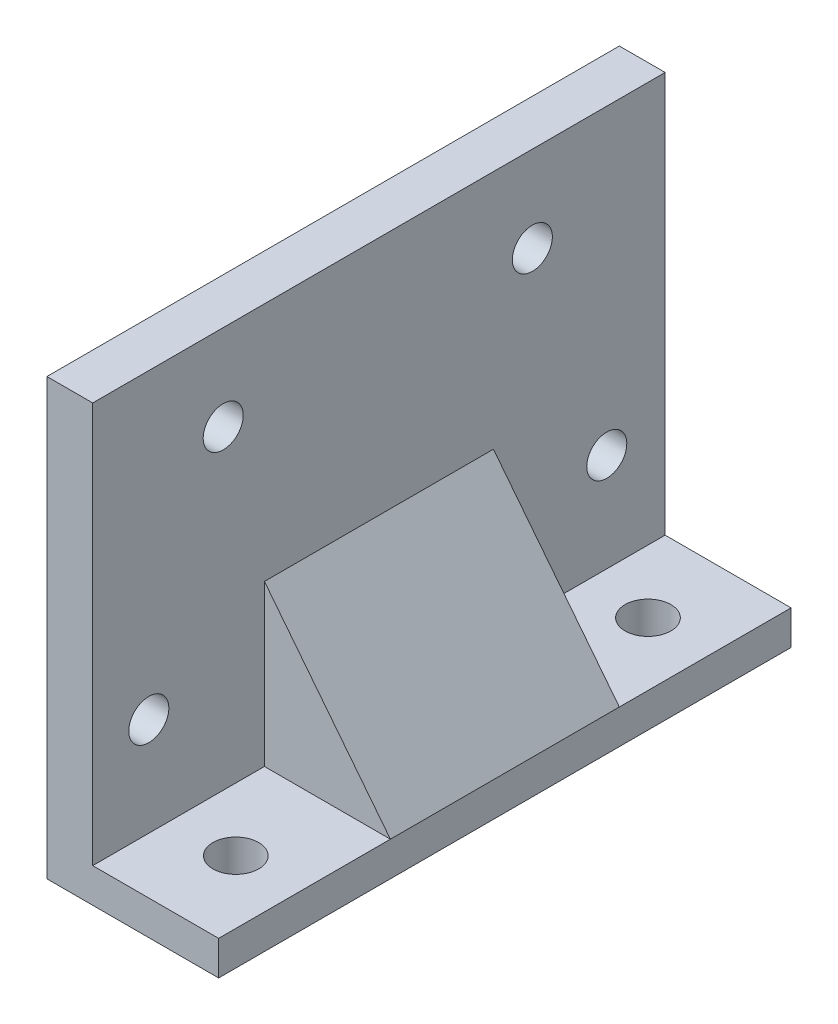
ISO-10303-21;
HEADER;
FILE_DESCRIPTION(('STEP AP214'),'2;1');
FILE_NAME('part.step','',(''),(''),'','','');
FILE_SCHEMA(('AUTOMOTIVE_DESIGN { 1 0 10303 214 1 1 1 1 }'));
ENDSEC;
DATA;
#1=APPLICATION_CONTEXT('core data for automotive mechanical design processes');
#2=APPLICATION_PROTOCOL_DEFINITION('international standard','automotive_design',2000,#1);
#3=PRODUCT_CONTEXT('',#1,'mechanical');
#4=PRODUCT('Part','Part','',(#3));
#5=PRODUCT_RELATED_PRODUCT_CATEGORY('part','',(#4));
#6=PRODUCT_DEFINITION_FORMATION('','',#4);
#7=PRODUCT_DEFINITION_CONTEXT('part definition',#1,'design');
#8=PRODUCT_DEFINITION('design','',#6,#7);
#9=PRODUCT_DEFINITION_SHAPE('','',#8);
#10=(LENGTH_UNIT() NAMED_UNIT(*) SI_UNIT(.MILLI.,.METRE.));
#11=(NAMED_UNIT(*) PLANE_ANGLE_UNIT() SI_UNIT($,.RADIAN.));
#12=(NAMED_UNIT(*) SI_UNIT($,.STERADIAN.) SOLID_ANGLE_UNIT());
#13=UNCERTAINTY_MEASURE_WITH_UNIT(LENGTH_MEASURE(1.E-05),#10,'distance_accuracy_value','');
#14=(GEOMETRIC_REPRESENTATION_CONTEXT(3) GLOBAL_UNCERTAINTY_ASSIGNED_CONTEXT((#13)) GLOBAL_UNIT_ASSIGNED_CONTEXT((#10,
#11,#12)) REPRESENTATION_CONTEXT('',''));
#15=CARTESIAN_POINT('',(0.,0.,0.));
#16=DIRECTION('',(0.,0.,1.));
#17=DIRECTION('',(1.,0.,0.));
#18=AXIS2_PLACEMENT_3D('',#15,#16,#17);
#19=CARTESIAN_POINT('',(15.,3.,50.));
#20=DIRECTION('',(0.,-1.,0.));
#21=DIRECTION('',(1.,0.,0.));
#22=AXIS2_PLACEMENT_3D('',#19,#20,#21);
#23=PLANE('',#22);
#24=CARTESIAN_POINT('',(9.5,3.,43.));
#25=DIRECTION('',(0.,1.,0.));
#26=DIRECTION('',(1.,0.,0.));
#27=AXIS2_PLACEMENT_3D('',#24,#25,#26);
#28=CIRCLE('',#27,2.);
#29=CARTESIAN_POINT('',(11.5,3.,43.));
#30=VERTEX_POINT('',#29);
#31=EDGE_CURVE('E172',#30,#30,#28,.T.);
#32=ORIENTED_EDGE('',*,*,#31,.F.);
#33=EDGE_LOOP('',(#32));
#34=FACE_BOUND('',#33,.T.);
#35=DIRECTION('',(1.,0.,0.));
#36=VECTOR('',#35,1.);
#37=CARTESIAN_POINT('',(15.,3.,35.));
#38=LINE('',#37,#36);
#39=CARTESIAN_POINT('',(4.,3.,35.));
#40=VERTEX_POINT('',#39);
#41=CARTESIAN_POINT('',(15.,3.,35.));
#42=VERTEX_POINT('',#41);
#43=EDGE_CURVE('E214',#40,#42,#38,.T.);
#44=ORIENTED_EDGE('',*,*,#43,.F.);
#45=DIRECTION('',(0.,0.,-1.));
#46=VECTOR('',#45,1.);
#47=CARTESIAN_POINT('',(4.,3.,50.));
#48=LINE('',#47,#46);
#49=CARTESIAN_POINT('',(4.,3.,50.));
#50=VERTEX_POINT('',#49);
#51=EDGE_CURVE('E255',#50,#40,#48,.T.);
#52=ORIENTED_EDGE('',*,*,#51,.F.);
#53=DIRECTION('',(-1.,0.,0.));
#54=VECTOR('',#53,1.);
#55=CARTESIAN_POINT('',(15.,3.,50.));
#56=LINE('',#55,#54);
#57=CARTESIAN_POINT('',(15.,3.,50.));
#58=VERTEX_POINT('',#57);
#59=EDGE_CURVE('E234',#58,#50,#56,.T.);
#60=ORIENTED_EDGE('',*,*,#59,.F.);
#61=DIRECTION('',(0.,0.,-1.));
#62=VECTOR('',#61,1.);
#63=CARTESIAN_POINT('',(15.,3.,50.));
#64=LINE('',#63,#62);
#65=EDGE_CURVE('E259',#58,#42,#64,.T.);
#66=ORIENTED_EDGE('',*,*,#65,.T.);
#67=EDGE_LOOP('',(#44,#52,#60,#66));
#68=FACE_BOUND('',#67,.T.);
#69=ADVANCED_FACE('F39',(#34,#68),#23,.F.);
#70=CARTESIAN_POINT('',(9.5,3.,7.));
#71=DIRECTION('',(0.,1.,0.));
#72=DIRECTION('',(-1.,0.,0.));
#73=AXIS2_PLACEMENT_3D('',#70,#71,#72);
#74=CIRCLE('',#73,2.);
#75=CARTESIAN_POINT('',(7.5,3.,7.));
#76=VERTEX_POINT('',#75);
#77=EDGE_CURVE('E176',#76,#76,#74,.T.);
#78=ORIENTED_EDGE('',*,*,#77,.F.);
#79=EDGE_LOOP('',(#78));
#80=FACE_BOUND('',#79,.T.);
#81=DIRECTION('',(-1.,0.,0.));
#82=VECTOR('',#81,1.);
#83=CARTESIAN_POINT('',(4.00000000000001,3.,15.));
#84=LINE('',#83,#82);
#85=CARTESIAN_POINT('',(15.,3.,15.));
#86=VERTEX_POINT('',#85);
#87=CARTESIAN_POINT('',(4.,3.,15.));
#88=VERTEX_POINT('',#87);
#89=EDGE_CURVE('E217',#86,#88,#84,.T.);
#90=ORIENTED_EDGE('',*,*,#89,.F.);
#91=CARTESIAN_POINT('',(15.,3.,0.));
#92=VERTEX_POINT('',#91);
#93=EDGE_CURVE('E258',#86,#92,#64,.T.);
#94=ORIENTED_EDGE('',*,*,#93,.T.);
#95=DIRECTION('',(-1.,0.,0.));
#96=VECTOR('',#95,1.);
#97=CARTESIAN_POINT('',(15.,3.,0.));
#98=LINE('',#97,#96);
#99=CARTESIAN_POINT('',(4.,3.,0.));
#100=VERTEX_POINT('',#99);
#101=EDGE_CURVE('E248',#92,#100,#98,.T.);
#102=ORIENTED_EDGE('',*,*,#101,.T.);
#103=EDGE_CURVE('E254',#88,#100,#48,.T.);
#104=ORIENTED_EDGE('',*,*,#103,.F.);
#105=EDGE_LOOP('',(#90,#94,#102,#104));
#106=FACE_BOUND('',#105,.T.);
#107=ADVANCED_FACE('F292',(#80,#106),#23,.F.);
#108=CARTESIAN_POINT('',(4.,3.,50.));
#109=DIRECTION('',(-1.,0.,0.));
#110=DIRECTION('',(0.,-1.,0.));
#111=AXIS2_PLACEMENT_3D('',#108,#109,#110);
#112=PLANE('',#111);
#113=CARTESIAN_POINT('',(4.,11.6000000000001,5.1));
#114=DIRECTION('',(-1.,0.,0.));
#115=DIRECTION('',(0.,-1.,0.));
#116=AXIS2_PLACEMENT_3D('',#113,#114,#115);
#117=CIRCLE('',#116,1.75);
#118=CARTESIAN_POINT('',(4.,9.85000000000005,5.1));
#119=VERTEX_POINT('',#118);
#120=EDGE_CURVE('E203',#119,#119,#117,.T.);
#121=ORIENTED_EDGE('',*,*,#120,.T.);
#122=EDGE_LOOP('',(#121));
#123=FACE_BOUND('',#122,.T.);
#124=CARTESIAN_POINT('',(4.,30.5,38.6));
#125=DIRECTION('',(-1.,0.,0.));
#126=DIRECTION('',(0.,-1.,0.));
#127=AXIS2_PLACEMENT_3D('',#124,#125,#126);
#128=CIRCLE('',#127,1.75);
#129=CARTESIAN_POINT('',(4.,28.75,38.6));
#130=VERTEX_POINT('',#129);
#131=EDGE_CURVE('E200',#130,#130,#128,.T.);
#132=ORIENTED_EDGE('',*,*,#131,.T.);
#133=EDGE_LOOP('',(#132));
#134=FACE_BOUND('',#133,.T.);
#135=CARTESIAN_POINT('',(4.,11.6,45.1));
#136=DIRECTION('',(-1.,0.,0.));
#137=DIRECTION('',(0.,-1.,0.));
#138=AXIS2_PLACEMENT_3D('',#135,#136,#137);
#139=CIRCLE('',#138,1.75);
#140=CARTESIAN_POINT('',(4.,9.85,45.1));
#141=VERTEX_POINT('',#140);
#142=EDGE_CURVE('E197',#141,#141,#139,.T.);
#143=ORIENTED_EDGE('',*,*,#142,.T.);
#144=EDGE_LOOP('',(#143));
#145=FACE_BOUND('',#144,.T.);
#146=CARTESIAN_POINT('',(4.,30.5,11.6));
#147=DIRECTION('',(-1.,0.,0.));
#148=DIRECTION('',(0.,-1.,0.));
#149=AXIS2_PLACEMENT_3D('',#146,#147,#148);
#150=CIRCLE('',#149,1.75);
#151=CARTESIAN_POINT('',(4.,28.75,11.6));
#152=VERTEX_POINT('',#151);
#153=EDGE_CURVE('E185',#152,#152,#150,.T.);
#154=ORIENTED_EDGE('',*,*,#153,.T.);
#155=EDGE_LOOP('',(#154));
#156=FACE_BOUND('',#155,.T.);
#157=DIRECTION('',(0.,1.,0.));
#158=VECTOR('',#157,1.);
#159=CARTESIAN_POINT('',(4.,3.,0.));
#160=LINE('',#159,#158);
#161=CARTESIAN_POINT('',(4.00000000000001,38.,0.));
#162=VERTEX_POINT('',#161);
#163=EDGE_CURVE('E228',#100,#162,#160,.T.);
#164=ORIENTED_EDGE('',*,*,#163,.T.);
#165=DIRECTION('',(0.,0.,-1.));
#166=VECTOR('',#165,1.);
#167=CARTESIAN_POINT('',(4.00000000000001,38.,50.));
#168=LINE('',#167,#166);
#169=CARTESIAN_POINT('',(4.00000000000001,38.,50.));
#170=VERTEX_POINT('',#169);
#171=EDGE_CURVE('E238',#170,#162,#168,.T.);
#172=ORIENTED_EDGE('',*,*,#171,.F.);
#173=DIRECTION('',(0.,1.,0.));
#174=VECTOR('',#173,1.);
#175=CARTESIAN_POINT('',(4.,3.,50.));
#176=LINE('',#175,#174);
#177=EDGE_CURVE('E236',#50,#170,#176,.T.);
#178=ORIENTED_EDGE('',*,*,#177,.F.);
#179=ORIENTED_EDGE('',*,*,#51,.T.);
#180=DIRECTION('',(0.,-1.,0.));
#181=VECTOR('',#180,1.);
#182=CARTESIAN_POINT('',(4.,33.,35.));
#183=LINE('',#182,#181);
#184=CARTESIAN_POINT('',(4.00000000000001,17.,35.));
#185=VERTEX_POINT('',#184);
#186=EDGE_CURVE('E220',#185,#40,#183,.T.);
#187=ORIENTED_EDGE('',*,*,#186,.F.);
#188=DIRECTION('',(0.,0.,1.));
#189=VECTOR('',#188,1.);
#190=CARTESIAN_POINT('',(4.00000000000001,17.,0.));
#191=LINE('',#190,#189);
#192=CARTESIAN_POINT('',(4.00000000000001,17.,15.));
#193=VERTEX_POINT('',#192);
#194=EDGE_CURVE('E207',#193,#185,#191,.T.);
#195=ORIENTED_EDGE('',*,*,#194,.F.);
#196=DIRECTION('',(0.,-1.,0.));
#197=VECTOR('',#196,1.);
#198=CARTESIAN_POINT('',(4.,33.,15.));
#199=LINE('',#198,#197);
#200=EDGE_CURVE('E64',#193,#88,#199,.T.);
#201=ORIENTED_EDGE('',*,*,#200,.T.);
#202=ORIENTED_EDGE('',*,*,#103,.T.);
#203=EDGE_LOOP('',(#164,#172,#178,#179,#187,#195,#201,#202));
#204=FACE_BOUND('',#203,.T.);
#205=ADVANCED_FACE('F298',(#123,#134,#145,#156,#204),#112,.F.);
#206=CARTESIAN_POINT('',(4.00000000000001,38.,50.));
#207=DIRECTION('',(0.,-1.,0.));
#208=DIRECTION('',(0.,0.,-1.));
#209=AXIS2_PLACEMENT_3D('',#206,#207,#208);
#210=PLANE('',#209);
#211=DIRECTION('',(-1.,0.,0.));
#212=VECTOR('',#211,1.);
#213=CARTESIAN_POINT('',(4.00000000000001,38.,0.));
#214=LINE('',#213,#212);
#215=CARTESIAN_POINT('',(0.,38.,0.));
#216=VERTEX_POINT('',#215);
#217=EDGE_CURVE('E223',#162,#216,#214,.T.);
#218=ORIENTED_EDGE('',*,*,#217,.T.);
#219=DIRECTION('',(0.,0.,-1.));
#220=VECTOR('',#219,1.);
#221=CARTESIAN_POINT('',(0.,38.,50.));
#222=LINE('',#221,#220);
#223=CARTESIAN_POINT('',(0.,38.,50.));
#224=VERTEX_POINT('',#223);
#225=EDGE_CURVE('E48',#224,#216,#222,.T.);
#226=ORIENTED_EDGE('',*,*,#225,.F.);
#227=DIRECTION('',(-1.,0.,0.));
#228=VECTOR('',#227,1.);
#229=CARTESIAN_POINT('',(4.00000000000001,38.,50.));
#230=LINE('',#229,#228);
#231=EDGE_CURVE('E224',#170,#224,#230,.T.);
#232=ORIENTED_EDGE('',*,*,#231,.F.);
#233=ORIENTED_EDGE('',*,*,#171,.T.);
#234=EDGE_LOOP('',(#218,#226,#232,#233));
#235=FACE_BOUND('',#234,.T.);
#236=ADVANCED_FACE('F41',(#235),#210,.F.);
#237=CARTESIAN_POINT('',(0.,38.,50.));
#238=DIRECTION('',(1.,0.,0.));
#239=DIRECTION('',(0.,1.,0.));
#240=AXIS2_PLACEMENT_3D('',#237,#238,#239);
#241=PLANE('',#240);
#242=DIRECTION('',(0.,0.,1.));
#243=VECTOR('',#242,1.);
#244=CARTESIAN_POINT('',(0.,8.5,28.85));
#245=LINE('',#244,#243);
#246=CARTESIAN_POINT('',(0.,8.5,28.85));
#247=VERTEX_POINT('',#246);
#248=CARTESIAN_POINT('',(0.,8.5,39.85));
#249=VERTEX_POINT('',#248);
#250=EDGE_CURVE('E166',#247,#249,#245,.T.);
#251=ORIENTED_EDGE('',*,*,#250,.F.);
#252=DIRECTION('',(0.,-1.,0.));
#253=VECTOR('',#252,1.);
#254=CARTESIAN_POINT('',(0.,14.,28.85));
#255=LINE('',#254,#253);
#256=CARTESIAN_POINT('',(0.,14.,28.85));
#257=VERTEX_POINT('',#256);
#258=EDGE_CURVE('E56',#257,#247,#255,.T.);
#259=ORIENTED_EDGE('',*,*,#258,.F.);
#260=DIRECTION('',(0.,0.,-1.));
#261=VECTOR('',#260,1.);
#262=CARTESIAN_POINT('',(0.,14.,28.85));
#263=LINE('',#262,#261);
#264=CARTESIAN_POINT('',(0.,14.,39.85));
#265=VERTEX_POINT('',#264);
#266=EDGE_CURVE('E157',#265,#257,#263,.T.);
#267=ORIENTED_EDGE('',*,*,#266,.F.);
#268=DIRECTION('',(0.,1.,0.));
#269=VECTOR('',#268,1.);
#270=CARTESIAN_POINT('',(0.,14.,39.85));
#271=LINE('',#270,#269);
#272=EDGE_CURVE('E160',#249,#265,#271,.T.);
#273=ORIENTED_EDGE('',*,*,#272,.F.);
#274=EDGE_LOOP('',(#251,#259,#267,#273));
#275=FACE_BOUND('',#274,.T.);
#276=CARTESIAN_POINT('',(0.,11.6000000000001,5.1));
#277=DIRECTION('',(-1.,0.,0.));
#278=DIRECTION('',(0.,-1.,0.));
#279=AXIS2_PLACEMENT_3D('',#276,#277,#278);
#280=CIRCLE('',#279,1.75);
#281=CARTESIAN_POINT('',(0.,9.85000000000005,5.1));
#282=VERTEX_POINT('',#281);
#283=EDGE_CURVE('E182',#282,#282,#280,.T.);
#284=ORIENTED_EDGE('',*,*,#283,.F.);
#285=EDGE_LOOP('',(#284));
#286=FACE_BOUND('',#285,.T.);
#287=CARTESIAN_POINT('',(0.,30.5,38.6));
#288=DIRECTION('',(-1.,0.,0.));
#289=DIRECTION('',(0.,1.,0.));
#290=AXIS2_PLACEMENT_3D('',#287,#288,#289);
#291=CIRCLE('',#290,1.75);
#292=CARTESIAN_POINT('',(0.,32.25,38.6));
#293=VERTEX_POINT('',#292);
#294=EDGE_CURVE('E187',#293,#293,#291,.T.);
#295=ORIENTED_EDGE('',*,*,#294,.F.);
#296=EDGE_LOOP('',(#295));
#297=FACE_BOUND('',#296,.T.);
#298=CARTESIAN_POINT('',(0.,11.6,45.1));
#299=DIRECTION('',(-1.,0.,0.));
#300=DIRECTION('',(0.,1.,0.));
#301=AXIS2_PLACEMENT_3D('',#298,#299,#300);
#302=CIRCLE('',#301,1.75);
#303=CARTESIAN_POINT('',(0.,13.35,45.1));
#304=VERTEX_POINT('',#303);
#305=EDGE_CURVE('E190',#304,#304,#302,.T.);
#306=ORIENTED_EDGE('',*,*,#305,.F.);
#307=EDGE_LOOP('',(#306));
#308=FACE_BOUND('',#307,.T.);
#309=CARTESIAN_POINT('',(0.,30.5,11.6));
#310=DIRECTION('',(-1.,0.,0.));
#311=DIRECTION('',(0.,-1.,0.));
#312=AXIS2_PLACEMENT_3D('',#309,#310,#311);
#313=CIRCLE('',#312,1.75);
#314=CARTESIAN_POINT('',(0.,28.75,11.6));
#315=VERTEX_POINT('',#314);
#316=EDGE_CURVE('E186',#315,#315,#313,.T.);
#317=ORIENTED_EDGE('',*,*,#316,.F.);
#318=EDGE_LOOP('',(#317));
#319=FACE_BOUND('',#318,.T.);
#320=DIRECTION('',(0.,-1.,0.));
#321=VECTOR('',#320,1.);
#322=CARTESIAN_POINT('',(0.,38.,0.));
#323=LINE('',#322,#321);
#324=CARTESIAN_POINT('',(0.,0.,0.));
#325=VERTEX_POINT('',#324);
#326=EDGE_CURVE('E241',#216,#325,#323,.T.);
#327=ORIENTED_EDGE('',*,*,#326,.T.);
#328=DIRECTION('',(0.,0.,-1.));
#329=VECTOR('',#328,1.);
#330=CARTESIAN_POINT('',(0.,0.,50.));
#331=LINE('',#330,#329);
#332=CARTESIAN_POINT('',(0.,0.,50.));
#333=VERTEX_POINT('',#332);
#334=EDGE_CURVE('E265',#333,#325,#331,.T.);
#335=ORIENTED_EDGE('',*,*,#334,.F.);
#336=DIRECTION('',(0.,-1.,0.));
#337=VECTOR('',#336,1.);
#338=CARTESIAN_POINT('',(0.,38.,50.));
#339=LINE('',#338,#337);
#340=EDGE_CURVE('E227',#224,#333,#339,.T.);
#341=ORIENTED_EDGE('',*,*,#340,.F.);
#342=ORIENTED_EDGE('',*,*,#225,.T.);
#343=EDGE_LOOP('',(#327,#335,#341,#342));
#344=FACE_BOUND('',#343,.T.);
#345=ADVANCED_FACE('F311',(#275,#286,#297,#308,#319,#344),#241,.F.);
#346=CARTESIAN_POINT('',(0.,0.,50.));
#347=DIRECTION('',(0.,1.,0.));
#348=DIRECTION('',(0.,0.,1.));
#349=AXIS2_PLACEMENT_3D('',#346,#347,#348);
#350=PLANE('',#349);
#351=CARTESIAN_POINT('',(9.5,0.,7.));
#352=DIRECTION('',(0.,1.,0.));
#353=DIRECTION('',(0.,0.,1.));
#354=AXIS2_PLACEMENT_3D('',#351,#352,#353);
#355=CIRCLE('',#354,2.);
#356=CARTESIAN_POINT('',(9.5,0.,9.));
#357=VERTEX_POINT('',#356);
#358=EDGE_CURVE('E43',#357,#357,#355,.T.);
#359=ORIENTED_EDGE('',*,*,#358,.T.);
#360=EDGE_LOOP('',(#359));
#361=FACE_BOUND('',#360,.T.);
#362=CARTESIAN_POINT('',(9.5,0.,43.));
#363=DIRECTION('',(0.,1.,0.));
#364=DIRECTION('',(0.,0.,1.));
#365=AXIS2_PLACEMENT_3D('',#362,#363,#364);
#366=CIRCLE('',#365,2.);
#367=CARTESIAN_POINT('',(9.5,0.,45.));
#368=VERTEX_POINT('',#367);
#369=EDGE_CURVE('E179',#368,#368,#366,.T.);
#370=ORIENTED_EDGE('',*,*,#369,.T.);
#371=EDGE_LOOP('',(#370));
#372=FACE_BOUND('',#371,.T.);
#373=DIRECTION('',(1.,0.,0.));
#374=VECTOR('',#373,1.);
#375=CARTESIAN_POINT('',(0.,0.,0.));
#376=LINE('',#375,#374);
#377=CARTESIAN_POINT('',(15.,0.,0.));
#378=VERTEX_POINT('',#377);
#379=EDGE_CURVE('E243',#325,#378,#376,.T.);
#380=ORIENTED_EDGE('',*,*,#379,.T.);
#381=DIRECTION('',(0.,0.,-1.));
#382=VECTOR('',#381,1.);
#383=CARTESIAN_POINT('',(15.,0.,50.));
#384=LINE('',#383,#382);
#385=CARTESIAN_POINT('',(15.,0.,50.));
#386=VERTEX_POINT('',#385);
#387=EDGE_CURVE('E262',#386,#378,#384,.T.);
#388=ORIENTED_EDGE('',*,*,#387,.F.);
#389=DIRECTION('',(1.,0.,0.));
#390=VECTOR('',#389,1.);
#391=CARTESIAN_POINT('',(0.,0.,50.));
#392=LINE('',#391,#390);
#393=EDGE_CURVE('E230',#333,#386,#392,.T.);
#394=ORIENTED_EDGE('',*,*,#393,.F.);
#395=ORIENTED_EDGE('',*,*,#334,.T.);
#396=EDGE_LOOP('',(#380,#388,#394,#395));
#397=FACE_BOUND('',#396,.T.);
#398=ADVANCED_FACE('F275',(#361,#372,#397),#350,.F.);
#399=CARTESIAN_POINT('',(15.,0.,50.));
#400=DIRECTION('',(-1.,0.,0.));
#401=DIRECTION('',(0.,0.,1.));
#402=AXIS2_PLACEMENT_3D('',#399,#400,#401);
#403=PLANE('',#402);
#404=ORIENTED_EDGE('',*,*,#93,.F.);
#405=DIRECTION('',(0.,0.,1.));
#406=VECTOR('',#405,1.);
#407=CARTESIAN_POINT('',(15.,3.,0.));
#408=LINE('',#407,#406);
#409=EDGE_CURVE('E206',#86,#42,#408,.T.);
#410=ORIENTED_EDGE('',*,*,#409,.T.);
#411=ORIENTED_EDGE('',*,*,#65,.F.);
#412=DIRECTION('',(0.,1.,0.));
#413=VECTOR('',#412,1.);
#414=CARTESIAN_POINT('',(15.,0.,50.));
#415=LINE('',#414,#413);
#416=EDGE_CURVE('E232',#386,#58,#415,.T.);
#417=ORIENTED_EDGE('',*,*,#416,.F.);
#418=ORIENTED_EDGE('',*,*,#387,.T.);
#419=DIRECTION('',(0.,1.,0.));
#420=VECTOR('',#419,1.);
#421=CARTESIAN_POINT('',(15.,0.,0.));
#422=LINE('',#421,#420);
#423=EDGE_CURVE('E245',#378,#92,#422,.T.);
#424=ORIENTED_EDGE('',*,*,#423,.T.);
#425=EDGE_LOOP('',(#404,#410,#411,#417,#418,#424));
#426=FACE_BOUND('',#425,.T.);
#427=ADVANCED_FACE('F305',(#426),#403,.F.);
#428=CARTESIAN_POINT('',(0.,0.,50.));
#429=DIRECTION('',(0.,0.,1.));
#430=DIRECTION('',(1.,0.,0.));
#431=AXIS2_PLACEMENT_3D('',#428,#429,#430);
#432=PLANE('',#431);
#433=ORIENTED_EDGE('',*,*,#231,.T.);
#434=ORIENTED_EDGE('',*,*,#340,.T.);
#435=ORIENTED_EDGE('',*,*,#393,.T.);
#436=ORIENTED_EDGE('',*,*,#416,.T.);
#437=ORIENTED_EDGE('',*,*,#59,.T.);
#438=ORIENTED_EDGE('',*,*,#177,.T.);
#439=EDGE_LOOP('',(#433,#434,#435,#436,#437,#438));
#440=FACE_BOUND('',#439,.T.);
#441=ADVANCED_FACE('F308',(#440),#432,.T.);
#442=CARTESIAN_POINT('',(0.,0.,0.));
#443=DIRECTION('',(0.,0.,1.));
#444=DIRECTION('',(1.,0.,0.));
#445=AXIS2_PLACEMENT_3D('',#442,#443,#444);
#446=PLANE('',#445);
#447=ORIENTED_EDGE('',*,*,#217,.F.);
#448=ORIENTED_EDGE('',*,*,#163,.F.);
#449=ORIENTED_EDGE('',*,*,#101,.F.);
#450=ORIENTED_EDGE('',*,*,#423,.F.);
#451=ORIENTED_EDGE('',*,*,#379,.F.);
#452=ORIENTED_EDGE('',*,*,#326,.F.);
#453=EDGE_LOOP('',(#447,#448,#449,#450,#451,#452));
#454=FACE_BOUND('',#453,.T.);
#455=ADVANCED_FACE('F337',(#454),#446,.F.);
#456=CARTESIAN_POINT('',(15.,33.,35.));
#457=DIRECTION('',(0.,0.,-1.));
#458=DIRECTION('',(-1.,0.,0.));
#459=AXIS2_PLACEMENT_3D('',#456,#457,#458);
#460=PLANE('',#459);
#461=ORIENTED_EDGE('',*,*,#43,.T.);
#462=DIRECTION('',(-0.617821551931903,0.786318338822423,0.));
#463=VECTOR('',#462,1.);
#464=CARTESIAN_POINT('',(0.425867507886429,21.5488958990536,35.));
#465=LINE('',#464,#463);
#466=EDGE_CURVE('E209',#42,#185,#465,.T.);
#467=ORIENTED_EDGE('',*,*,#466,.T.);
#468=ORIENTED_EDGE('',*,*,#186,.T.);
#469=EDGE_LOOP('',(#461,#467,#468));
#470=FACE_BOUND('',#469,.T.);
#471=ADVANCED_FACE('F358',(#470),#460,.F.);
#472=CARTESIAN_POINT('',(4.,33.,15.));
#473=DIRECTION('',(0.,0.,1.));
#474=DIRECTION('',(1.,0.,0.));
#475=AXIS2_PLACEMENT_3D('',#472,#473,#474);
#476=PLANE('',#475);
#477=ORIENTED_EDGE('',*,*,#200,.F.);
#478=DIRECTION('',(0.617821551931903,-0.786318338822423,0.));
#479=VECTOR('',#478,1.);
#480=CARTESIAN_POINT('',(-3.77287066246056,26.8927444794953,15.));
#481=LINE('',#480,#479);
#482=EDGE_CURVE('E11',#193,#86,#481,.T.);
#483=ORIENTED_EDGE('',*,*,#482,.T.);
#484=ORIENTED_EDGE('',*,*,#89,.T.);
#485=EDGE_LOOP('',(#477,#483,#484));
#486=FACE_BOUND('',#485,.T.);
#487=ADVANCED_FACE('F352',(#486),#476,.F.);
#488=CARTESIAN_POINT('',(4.00000000000001,17.,0.));
#489=DIRECTION('',(-0.786318338822423,-0.617821551931903,0.));
#490=DIRECTION('',(0.617821551931903,-0.786318338822423,0.));
#491=AXIS2_PLACEMENT_3D('',#488,#489,#490);
#492=PLANE('',#491);
#493=ORIENTED_EDGE('',*,*,#409,.F.);
#494=ORIENTED_EDGE('',*,*,#482,.F.);
#495=ORIENTED_EDGE('',*,*,#194,.T.);
#496=ORIENTED_EDGE('',*,*,#466,.F.);
#497=EDGE_LOOP('',(#493,#494,#495,#496));
#498=FACE_BOUND('',#497,.T.);
#499=ADVANCED_FACE('F354',(#498),#492,.F.);
#500=CARTESIAN_POINT('',(30.,30.5,11.6));
#501=DIRECTION('',(-1.,0.,0.));
#502=DIRECTION('',(0.,-1.,0.));
#503=AXIS2_PLACEMENT_3D('',#500,#501,#502);
#504=CYLINDRICAL_SURFACE('',#503,1.75);
#505=ORIENTED_EDGE('',*,*,#316,.T.);
#506=EDGE_LOOP('',(#505));
#507=FACE_BOUND('',#506,.T.);
#508=ORIENTED_EDGE('',*,*,#153,.F.);
#509=EDGE_LOOP('',(#508));
#510=FACE_BOUND('',#509,.T.);
#511=ADVANCED_FACE('F399',(#507,#510),#504,.F.);
#512=CARTESIAN_POINT('',(30.,11.6,45.1));
#513=DIRECTION('',(-1.,0.,0.));
#514=DIRECTION('',(0.,-1.,0.));
#515=AXIS2_PLACEMENT_3D('',#512,#513,#514);
#516=CYLINDRICAL_SURFACE('',#515,1.75);
#517=ORIENTED_EDGE('',*,*,#305,.T.);
#518=EDGE_LOOP('',(#517));
#519=FACE_BOUND('',#518,.T.);
#520=ORIENTED_EDGE('',*,*,#142,.F.);
#521=EDGE_LOOP('',(#520));
#522=FACE_BOUND('',#521,.T.);
#523=ADVANCED_FACE('F414',(#519,#522),#516,.F.);
#524=CARTESIAN_POINT('',(30.,30.5,38.6));
#525=DIRECTION('',(-1.,0.,0.));
#526=DIRECTION('',(0.,-1.,0.));
#527=AXIS2_PLACEMENT_3D('',#524,#525,#526);
#528=CYLINDRICAL_SURFACE('',#527,1.75);
#529=ORIENTED_EDGE('',*,*,#294,.T.);
#530=EDGE_LOOP('',(#529));
#531=FACE_BOUND('',#530,.T.);
#532=ORIENTED_EDGE('',*,*,#131,.F.);
#533=EDGE_LOOP('',(#532));
#534=FACE_BOUND('',#533,.T.);
#535=ADVANCED_FACE('F424',(#531,#534),#528,.F.);
#536=CARTESIAN_POINT('',(30.,11.6000000000001,5.1));
#537=DIRECTION('',(-1.,0.,0.));
#538=DIRECTION('',(0.,-1.,0.));
#539=AXIS2_PLACEMENT_3D('',#536,#537,#538);
#540=CYLINDRICAL_SURFACE('',#539,1.75);
#541=ORIENTED_EDGE('',*,*,#283,.T.);
#542=EDGE_LOOP('',(#541));
#543=FACE_BOUND('',#542,.T.);
#544=ORIENTED_EDGE('',*,*,#120,.F.);
#545=EDGE_LOOP('',(#544));
#546=FACE_BOUND('',#545,.T.);
#547=ADVANCED_FACE('F288',(#543,#546),#540,.F.);
#548=CARTESIAN_POINT('',(9.50000000000001,-27.,43.));
#549=DIRECTION('',(0.,1.,0.));
#550=DIRECTION('',(-1.,0.,0.));
#551=AXIS2_PLACEMENT_3D('',#548,#549,#550);
#552=CYLINDRICAL_SURFACE('',#551,2.);
#553=ORIENTED_EDGE('',*,*,#31,.T.);
#554=EDGE_LOOP('',(#553));
#555=FACE_BOUND('',#554,.T.);
#556=ORIENTED_EDGE('',*,*,#369,.F.);
#557=EDGE_LOOP('',(#556));
#558=FACE_BOUND('',#557,.T.);
#559=ADVANCED_FACE('F279',(#555,#558),#552,.F.);
#560=CARTESIAN_POINT('',(9.50000000000001,-27.,7.));
#561=DIRECTION('',(0.,1.,0.));
#562=DIRECTION('',(-1.,0.,0.));
#563=AXIS2_PLACEMENT_3D('',#560,#561,#562);
#564=CYLINDRICAL_SURFACE('',#563,2.);
#565=ORIENTED_EDGE('',*,*,#77,.T.);
#566=EDGE_LOOP('',(#565));
#567=FACE_BOUND('',#566,.T.);
#568=ORIENTED_EDGE('',*,*,#358,.F.);
#569=EDGE_LOOP('',(#568));
#570=FACE_BOUND('',#569,.T.);
#571=ADVANCED_FACE('F277',(#567,#570),#564,.F.);
#572=CARTESIAN_POINT('',(2.,14.,28.85));
#573=DIRECTION('',(0.,0.,-1.));
#574=DIRECTION('',(-1.,0.,0.));
#575=AXIS2_PLACEMENT_3D('',#572,#573,#574);
#576=PLANE('',#575);
#577=ORIENTED_EDGE('',*,*,#258,.T.);
#578=DIRECTION('',(-1.,0.,0.));
#579=VECTOR('',#578,1.);
#580=CARTESIAN_POINT('',(2.,8.5,28.85));
#581=LINE('',#580,#579);
#582=CARTESIAN_POINT('',(2.,8.5,28.85));
#583=VERTEX_POINT('',#582);
#584=EDGE_CURVE('E135',#583,#247,#581,.T.);
#585=ORIENTED_EDGE('',*,*,#584,.F.);
#586=DIRECTION('',(0.,-1.,0.));
#587=VECTOR('',#586,1.);
#588=CARTESIAN_POINT('',(2.,14.,28.85));
#589=LINE('',#588,#587);
#590=CARTESIAN_POINT('',(2.,14.,28.85));
#591=VERTEX_POINT('',#590);
#592=EDGE_CURVE('E139',#591,#583,#589,.T.);
#593=ORIENTED_EDGE('',*,*,#592,.F.);
#594=DIRECTION('',(-1.,0.,0.));
#595=VECTOR('',#594,1.);
#596=CARTESIAN_POINT('',(2.,14.,28.85));
#597=LINE('',#596,#595);
#598=EDGE_CURVE('E170',#591,#257,#597,.T.);
#599=ORIENTED_EDGE('',*,*,#598,.T.);
#600=EDGE_LOOP('',(#577,#585,#593,#599));
#601=FACE_BOUND('',#600,.T.);
#602=ADVANCED_FACE('F137',(#601),#576,.F.);
#603=CARTESIAN_POINT('',(2.,14.,28.85));
#604=DIRECTION('',(0.,1.,0.));
#605=DIRECTION('',(-1.,0.,0.));
#606=AXIS2_PLACEMENT_3D('',#603,#604,#605);
#607=PLANE('',#606);
#608=ORIENTED_EDGE('',*,*,#266,.T.);
#609=ORIENTED_EDGE('',*,*,#598,.F.);
#610=DIRECTION('',(0.,0.,-1.));
#611=VECTOR('',#610,1.);
#612=CARTESIAN_POINT('',(2.,14.,28.85));
#613=LINE('',#612,#611);
#614=CARTESIAN_POINT('',(2.,14.,39.85));
#615=VERTEX_POINT('',#614);
#616=EDGE_CURVE('E145',#615,#591,#613,.T.);
#617=ORIENTED_EDGE('',*,*,#616,.F.);
#618=DIRECTION('',(-1.,0.,0.));
#619=VECTOR('',#618,1.);
#620=CARTESIAN_POINT('',(2.,14.,39.85));
#621=LINE('',#620,#619);
#622=EDGE_CURVE('E173',#615,#265,#621,.T.);
#623=ORIENTED_EDGE('',*,*,#622,.T.);
#624=EDGE_LOOP('',(#608,#609,#617,#623));
#625=FACE_BOUND('',#624,.T.);
#626=ADVANCED_FACE('F286',(#625),#607,.F.);
#627=CARTESIAN_POINT('',(2.,14.,39.85));
#628=DIRECTION('',(0.,0.,1.));
#629=DIRECTION('',(1.,0.,0.));
#630=AXIS2_PLACEMENT_3D('',#627,#628,#629);
#631=PLANE('',#630);
#632=ORIENTED_EDGE('',*,*,#272,.T.);
#633=ORIENTED_EDGE('',*,*,#622,.F.);
#634=DIRECTION('',(0.,1.,0.));
#635=VECTOR('',#634,1.);
#636=CARTESIAN_POINT('',(2.,14.,39.85));
#637=LINE('',#636,#635);
#638=CARTESIAN_POINT('',(2.,8.5,39.85));
#639=VERTEX_POINT('',#638);
#640=EDGE_CURVE('E153',#639,#615,#637,.T.);
#641=ORIENTED_EDGE('',*,*,#640,.F.);
#642=DIRECTION('',(-1.,0.,0.));
#643=VECTOR('',#642,1.);
#644=CARTESIAN_POINT('',(2.,8.5,39.85));
#645=LINE('',#644,#643);
#646=EDGE_CURVE('E144',#639,#249,#645,.T.);
#647=ORIENTED_EDGE('',*,*,#646,.T.);
#648=EDGE_LOOP('',(#632,#633,#641,#647));
#649=FACE_BOUND('',#648,.T.);
#650=ADVANCED_FACE('F490',(#649),#631,.F.);
#651=CARTESIAN_POINT('',(2.,8.5,28.85));
#652=DIRECTION('',(0.,-1.,0.));
#653=DIRECTION('',(1.,0.,0.));
#654=AXIS2_PLACEMENT_3D('',#651,#652,#653);
#655=PLANE('',#654);
#656=ORIENTED_EDGE('',*,*,#250,.T.);
#657=ORIENTED_EDGE('',*,*,#646,.F.);
#658=DIRECTION('',(0.,0.,1.));
#659=VECTOR('',#658,1.);
#660=CARTESIAN_POINT('',(2.,8.5,28.85));
#661=LINE('',#660,#659);
#662=EDGE_CURVE('E148',#583,#639,#661,.T.);
#663=ORIENTED_EDGE('',*,*,#662,.F.);
#664=ORIENTED_EDGE('',*,*,#584,.T.);
#665=EDGE_LOOP('',(#656,#657,#663,#664));
#666=FACE_BOUND('',#665,.T.);
#667=ADVANCED_FACE('F149',(#666),#655,.F.);
#668=CARTESIAN_POINT('',(2.,0.,0.));
#669=DIRECTION('',(-1.,0.,0.));
#670=DIRECTION('',(0.,-1.,0.));
#671=AXIS2_PLACEMENT_3D('',#668,#669,#670);
#672=PLANE('',#671);
#673=ORIENTED_EDGE('',*,*,#592,.T.);
#674=ORIENTED_EDGE('',*,*,#662,.T.);
#675=ORIENTED_EDGE('',*,*,#640,.T.);
#676=ORIENTED_EDGE('',*,*,#616,.T.);
#677=EDGE_LOOP('',(#673,#674,#675,#676));
#678=FACE_BOUND('',#677,.T.);
#679=ADVANCED_FACE('F155',(#678),#672,.T.);
#680=CLOSED_SHELL('',(#69,#107,#205,#236,#345,#398,#427,#441,#455,#471,#487,#499,#511,#523,#535,
#547,#559,#571,#602,#626,#650,#667,#679));
#681=MANIFOLD_SOLID_BREP('B2',#680);
#682=ADVANCED_BREP_SHAPE_REPRESENTATION('',(#18,#681),#14);
#683=SHAPE_DEFINITION_REPRESENTATION(#9,#682);
ENDSEC;
END-ISO-10303-21;
